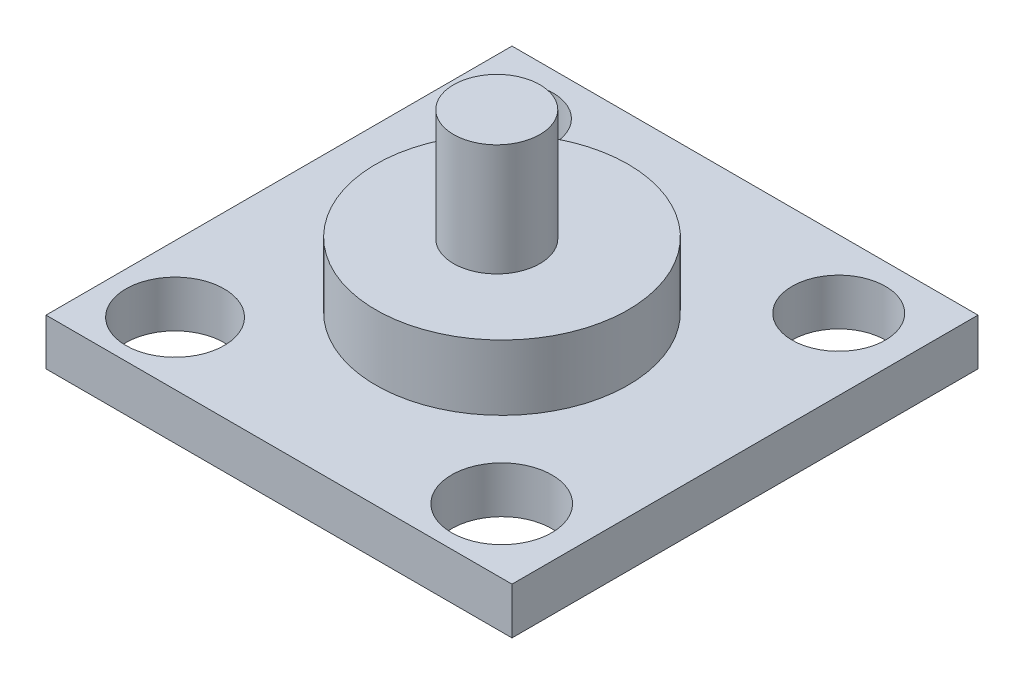
ISO-10303-21;
HEADER;
FILE_DESCRIPTION(('STEP AP214'),'2;1');
FILE_NAME('part.step','',(''),(''),'','','');
FILE_SCHEMA(('AUTOMOTIVE_DESIGN { 1 0 10303 214 1 1 1 1 }'));
ENDSEC;
DATA;
#1=APPLICATION_CONTEXT('core data for automotive mechanical design processes');
#2=APPLICATION_PROTOCOL_DEFINITION('international standard','automotive_design',2000,#1);
#3=PRODUCT_CONTEXT('',#1,'mechanical');
#4=PRODUCT('Part','Part','',(#3));
#5=PRODUCT_RELATED_PRODUCT_CATEGORY('part','',(#4));
#6=PRODUCT_DEFINITION_FORMATION('','',#4);
#7=PRODUCT_DEFINITION_CONTEXT('part definition',#1,'design');
#8=PRODUCT_DEFINITION('design','',#6,#7);
#9=PRODUCT_DEFINITION_SHAPE('','',#8);
#10=(LENGTH_UNIT() NAMED_UNIT(*) SI_UNIT(.MILLI.,.METRE.));
#11=(NAMED_UNIT(*) PLANE_ANGLE_UNIT() SI_UNIT($,.RADIAN.));
#12=(NAMED_UNIT(*) SI_UNIT($,.STERADIAN.) SOLID_ANGLE_UNIT());
#13=UNCERTAINTY_MEASURE_WITH_UNIT(LENGTH_MEASURE(1.E-05),#10,'distance_accuracy_value','');
#14=(GEOMETRIC_REPRESENTATION_CONTEXT(3) GLOBAL_UNCERTAINTY_ASSIGNED_CONTEXT((#13)) GLOBAL_UNIT_ASSIGNED_CONTEXT((#10,
#11,#12)) REPRESENTATION_CONTEXT('',''));
#15=CARTESIAN_POINT('',(0.,0.,0.));
#16=DIRECTION('',(0.,0.,1.));
#17=DIRECTION('',(1.,0.,0.));
#18=AXIS2_PLACEMENT_3D('',#15,#16,#17);
#19=CARTESIAN_POINT('',(67.7047001566798,1.27,0.));
#20=DIRECTION('',(1.,0.,0.));
#21=DIRECTION('',(0.,0.,-1.));
#22=AXIS2_PLACEMENT_3D('',#19,#20,#21);
#23=PLANE('',#22);
#24=DIRECTION('',(0.,0.,1.));
#25=VECTOR('',#24,1.);
#26=CARTESIAN_POINT('',(67.7047001566798,0.,0.));
#27=LINE('',#26,#25);
#28=CARTESIAN_POINT('',(67.7047001566798,0.,-15.0304434347829));
#29=VERTEX_POINT('',#28);
#30=CARTESIAN_POINT('',(67.7047001566798,0.,-2.33044343478292));
#31=VERTEX_POINT('',#30);
#32=EDGE_CURVE('E108',#29,#31,#27,.T.);
#33=ORIENTED_EDGE('',*,*,#32,.F.);
#34=DIRECTION('',(0.,-1.,0.));
#35=VECTOR('',#34,1.);
#36=CARTESIAN_POINT('',(67.7047001566798,1.27,-15.0304434347829));
#37=LINE('',#36,#35);
#38=CARTESIAN_POINT('',(67.7047001566798,1.27,-15.0304434347829));
#39=VERTEX_POINT('',#38);
#40=EDGE_CURVE('E49',#39,#29,#37,.T.);
#41=ORIENTED_EDGE('',*,*,#40,.F.);
#42=DIRECTION('',(0.,0.,1.));
#43=VECTOR('',#42,1.);
#44=CARTESIAN_POINT('',(67.7047001566798,1.27,0.));
#45=LINE('',#44,#43);
#46=CARTESIAN_POINT('',(67.7047001566798,1.27,-2.33044343478292));
#47=VERTEX_POINT('',#46);
#48=EDGE_CURVE('E101',#39,#47,#45,.T.);
#49=ORIENTED_EDGE('',*,*,#48,.T.);
#50=DIRECTION('',(0.,-1.,0.));
#51=VECTOR('',#50,1.);
#52=CARTESIAN_POINT('',(67.7047001566798,1.27,-2.33044343478292));
#53=LINE('',#52,#51);
#54=EDGE_CURVE('E80',#47,#31,#53,.T.);
#55=ORIENTED_EDGE('',*,*,#54,.T.);
#56=EDGE_LOOP('',(#33,#41,#49,#55));
#57=FACE_BOUND('',#56,.T.);
#58=ADVANCED_FACE('F41',(#57),#23,.T.);
#59=CARTESIAN_POINT('',(0.,1.27,-15.0304434347829));
#60=DIRECTION('',(0.,0.,-1.));
#61=DIRECTION('',(-1.,0.,0.));
#62=AXIS2_PLACEMENT_3D('',#59,#60,#61);
#63=PLANE('',#62);
#64=DIRECTION('',(1.,0.,0.));
#65=VECTOR('',#64,1.);
#66=CARTESIAN_POINT('',(0.,0.,-15.0304434347829));
#67=LINE('',#66,#65);
#68=CARTESIAN_POINT('',(55.0047001566799,0.,-15.0304434347829));
#69=VERTEX_POINT('',#68);
#70=EDGE_CURVE('E94',#69,#29,#67,.T.);
#71=ORIENTED_EDGE('',*,*,#70,.F.);
#72=DIRECTION('',(0.,-1.,0.));
#73=VECTOR('',#72,1.);
#74=CARTESIAN_POINT('',(55.0047001566799,1.27,-15.0304434347829));
#75=LINE('',#74,#73);
#76=CARTESIAN_POINT('',(55.0047001566799,1.27,-15.0304434347829));
#77=VERTEX_POINT('',#76);
#78=EDGE_CURVE('E88',#77,#69,#75,.T.);
#79=ORIENTED_EDGE('',*,*,#78,.F.);
#80=DIRECTION('',(1.,0.,0.));
#81=VECTOR('',#80,1.);
#82=CARTESIAN_POINT('',(0.,1.27,-15.0304434347829));
#83=LINE('',#82,#81);
#84=EDGE_CURVE('E92',#77,#39,#83,.T.);
#85=ORIENTED_EDGE('',*,*,#84,.T.);
#86=ORIENTED_EDGE('',*,*,#40,.T.);
#87=EDGE_LOOP('',(#71,#79,#85,#86));
#88=FACE_BOUND('',#87,.T.);
#89=ADVANCED_FACE('F90',(#88),#63,.T.);
#90=CARTESIAN_POINT('',(55.0047001566798,1.27,0.));
#91=DIRECTION('',(1.,0.,0.));
#92=DIRECTION('',(0.,0.,-1.));
#93=AXIS2_PLACEMENT_3D('',#90,#91,#92);
#94=PLANE('',#93);
#95=DIRECTION('',(0.,0.,1.));
#96=VECTOR('',#95,1.);
#97=CARTESIAN_POINT('',(55.0047001566798,0.,0.));
#98=LINE('',#97,#96);
#99=CARTESIAN_POINT('',(55.0047001566798,0.,-2.33044343478292));
#100=VERTEX_POINT('',#99);
#101=EDGE_CURVE('E73',#69,#100,#98,.T.);
#102=ORIENTED_EDGE('',*,*,#101,.T.);
#103=DIRECTION('',(0.,-1.,0.));
#104=VECTOR('',#103,1.);
#105=CARTESIAN_POINT('',(55.0047001566798,1.27,-2.33044343478292));
#106=LINE('',#105,#104);
#107=CARTESIAN_POINT('',(55.0047001566798,1.27,-2.33044343478292));
#108=VERTEX_POINT('',#107);
#109=EDGE_CURVE('E95',#108,#100,#106,.T.);
#110=ORIENTED_EDGE('',*,*,#109,.F.);
#111=DIRECTION('',(0.,0.,1.));
#112=VECTOR('',#111,1.);
#113=CARTESIAN_POINT('',(55.0047001566798,1.27,0.));
#114=LINE('',#113,#112);
#115=EDGE_CURVE('E97',#77,#108,#114,.T.);
#116=ORIENTED_EDGE('',*,*,#115,.F.);
#117=ORIENTED_EDGE('',*,*,#78,.T.);
#118=EDGE_LOOP('',(#102,#110,#116,#117));
#119=FACE_BOUND('',#118,.T.);
#120=ADVANCED_FACE('F98',(#119),#94,.F.);
#121=CARTESIAN_POINT('',(0.,1.27,-2.33044343478292));
#122=DIRECTION('',(0.,0.,-1.));
#123=DIRECTION('',(-1.,0.,0.));
#124=AXIS2_PLACEMENT_3D('',#121,#122,#123);
#125=PLANE('',#124);
#126=DIRECTION('',(1.,0.,0.));
#127=VECTOR('',#126,1.);
#128=CARTESIAN_POINT('',(0.,0.,-2.33044343478292));
#129=LINE('',#128,#127);
#130=EDGE_CURVE('E103',#100,#31,#129,.T.);
#131=ORIENTED_EDGE('',*,*,#130,.T.);
#132=ORIENTED_EDGE('',*,*,#54,.F.);
#133=DIRECTION('',(1.,0.,0.));
#134=VECTOR('',#133,1.);
#135=CARTESIAN_POINT('',(0.,1.27,-2.33044343478292));
#136=LINE('',#135,#134);
#137=EDGE_CURVE('E57',#108,#47,#136,.T.);
#138=ORIENTED_EDGE('',*,*,#137,.F.);
#139=ORIENTED_EDGE('',*,*,#109,.T.);
#140=EDGE_LOOP('',(#131,#132,#138,#139));
#141=FACE_BOUND('',#140,.T.);
#142=ADVANCED_FACE('F120',(#141),#125,.F.);
#143=CARTESIAN_POINT('',(0.,1.27,0.));
#144=DIRECTION('',(0.,1.,0.));
#145=DIRECTION('',(0.,0.,1.));
#146=AXIS2_PLACEMENT_3D('',#143,#144,#145);
#147=PLANE('',#146);
#148=CARTESIAN_POINT('',(61.1539853791689,1.27,-8.60832124117808));
#149=DIRECTION('',(0.,1.,0.));
#150=DIRECTION('',(0.,0.,1.));
#151=AXIS2_PLACEMENT_3D('',#148,#149,#150);
#152=CIRCLE('',#151,3.43807672808481);
#153=CARTESIAN_POINT('',(61.1539853791689,1.27,-12.0463979692629));
#154=VERTEX_POINT('',#153);
#155=EDGE_CURVE('E259',#154,#154,#152,.T.);
#156=ORIENTED_EDGE('',*,*,#155,.F.);
#157=EDGE_LOOP('',(#156));
#158=FACE_BOUND('',#157,.T.);
#159=CARTESIAN_POINT('',(56.812601391577,1.27,-4.03970862787468));
#160=DIRECTION('',(0.,1.,0.));
#161=DIRECTION('',(0.,0.,1.));
#162=AXIS2_PLACEMENT_3D('',#159,#160,#161);
#163=CIRCLE('',#162,1.33890735497977);
#164=CARTESIAN_POINT('',(56.812601391577,1.27,-2.70080127289491));
#165=VERTEX_POINT('',#164);
#166=EDGE_CURVE('E281',#165,#165,#163,.T.);
#167=ORIENTED_EDGE('',*,*,#166,.F.);
#168=EDGE_LOOP('',(#167));
#169=FACE_BOUND('',#168,.T.);
#170=CARTESIAN_POINT('',(65.6678895108768,1.27,-4.08681122425393));
#171=DIRECTION('',(0.,1.,0.));
#172=DIRECTION('',(0.,0.,1.));
#173=AXIS2_PLACEMENT_3D('',#170,#171,#172);
#174=CIRCLE('',#173,1.36597529499837);
#175=CARTESIAN_POINT('',(65.6678895108768,1.27,-2.72083592925556));
#176=VERTEX_POINT('',#175);
#177=EDGE_CURVE('E275',#176,#176,#174,.T.);
#178=ORIENTED_EDGE('',*,*,#177,.F.);
#179=EDGE_LOOP('',(#178));
#180=FACE_BOUND('',#179,.T.);
#181=CARTESIAN_POINT('',(65.7620947036353,1.27,-13.17761232545));
#182=DIRECTION('',(0.,1.,0.));
#183=DIRECTION('',(0.,0.,1.));
#184=AXIS2_PLACEMENT_3D('',#181,#182,#183);
#185=CIRCLE('',#184,1.27177010223988);
#186=CARTESIAN_POINT('',(65.7620947036353,1.27,-11.9058422232102));
#187=VERTEX_POINT('',#186);
#188=EDGE_CURVE('E268',#187,#187,#185,.T.);
#189=ORIENTED_EDGE('',*,*,#188,.F.);
#190=EDGE_LOOP('',(#189));
#191=FACE_BOUND('',#190,.T.);
#192=CARTESIAN_POINT('',(56.6712936024392,1.27,-13.2718175182085));
#193=DIRECTION('',(0.,1.,0.));
#194=DIRECTION('',(0.,0.,1.));
#195=AXIS2_PLACEMENT_3D('',#192,#193,#194);
#196=CIRCLE('',#195,1.21100399715519);
#197=CARTESIAN_POINT('',(56.6712936024392,1.27,-12.0608135210534));
#198=VERTEX_POINT('',#197);
#199=EDGE_CURVE('E271',#198,#198,#196,.T.);
#200=ORIENTED_EDGE('',*,*,#199,.F.);
#201=EDGE_LOOP('',(#200));
#202=FACE_BOUND('',#201,.T.);
#203=ORIENTED_EDGE('',*,*,#48,.F.);
#204=ORIENTED_EDGE('',*,*,#84,.F.);
#205=ORIENTED_EDGE('',*,*,#115,.T.);
#206=ORIENTED_EDGE('',*,*,#137,.T.);
#207=EDGE_LOOP('',(#203,#204,#205,#206));
#208=FACE_BOUND('',#207,.T.);
#209=ADVANCED_FACE('F100',(#158,#169,#180,#191,#202,#208),#147,.T.);
#210=CARTESIAN_POINT('',(0.,0.,0.));
#211=DIRECTION('',(0.,1.,0.));
#212=DIRECTION('',(0.,0.,1.));
#213=AXIS2_PLACEMENT_3D('',#210,#211,#212);
#214=PLANE('',#213);
#215=CARTESIAN_POINT('',(56.812601391577,0.,-4.03970862787468));
#216=DIRECTION('',(0.,1.,0.));
#217=DIRECTION('',(0.,0.,1.));
#218=AXIS2_PLACEMENT_3D('',#215,#216,#217);
#219=CIRCLE('',#218,1.33890735497977);
#220=CARTESIAN_POINT('',(56.812601391577,0.,-2.70080127289491));
#221=VERTEX_POINT('',#220);
#222=EDGE_CURVE('E266',#221,#221,#219,.T.);
#223=ORIENTED_EDGE('',*,*,#222,.T.);
#224=EDGE_LOOP('',(#223));
#225=FACE_BOUND('',#224,.T.);
#226=CARTESIAN_POINT('',(65.6678895108768,0.,-4.08681122425393));
#227=DIRECTION('',(0.,1.,0.));
#228=DIRECTION('',(0.,0.,1.));
#229=AXIS2_PLACEMENT_3D('',#226,#227,#228);
#230=CIRCLE('',#229,1.36597529499837);
#231=CARTESIAN_POINT('',(65.6678895108768,0.,-2.72083592925556));
#232=VERTEX_POINT('',#231);
#233=EDGE_CURVE('E278',#232,#232,#230,.T.);
#234=ORIENTED_EDGE('',*,*,#233,.T.);
#235=EDGE_LOOP('',(#234));
#236=FACE_BOUND('',#235,.T.);
#237=CARTESIAN_POINT('',(65.7620947036353,0.,-13.17761232545));
#238=DIRECTION('',(0.,1.,0.));
#239=DIRECTION('',(0.,0.,1.));
#240=AXIS2_PLACEMENT_3D('',#237,#238,#239);
#241=CIRCLE('',#240,1.27177010223988);
#242=CARTESIAN_POINT('',(65.7620947036353,0.,-11.9058422232102));
#243=VERTEX_POINT('',#242);
#244=EDGE_CURVE('E272',#243,#243,#241,.T.);
#245=ORIENTED_EDGE('',*,*,#244,.T.);
#246=EDGE_LOOP('',(#245));
#247=FACE_BOUND('',#246,.T.);
#248=CARTESIAN_POINT('',(56.6712936024392,0.,-13.2718175182085));
#249=DIRECTION('',(0.,1.,0.));
#250=DIRECTION('',(0.,0.,1.));
#251=AXIS2_PLACEMENT_3D('',#248,#249,#250);
#252=CIRCLE('',#251,1.21100399715519);
#253=CARTESIAN_POINT('',(56.6712936024392,0.,-12.0608135210534));
#254=VERTEX_POINT('',#253);
#255=EDGE_CURVE('E111',#254,#254,#252,.T.);
#256=ORIENTED_EDGE('',*,*,#255,.T.);
#257=EDGE_LOOP('',(#256));
#258=FACE_BOUND('',#257,.T.);
#259=ORIENTED_EDGE('',*,*,#32,.T.);
#260=ORIENTED_EDGE('',*,*,#130,.F.);
#261=ORIENTED_EDGE('',*,*,#101,.F.);
#262=ORIENTED_EDGE('',*,*,#70,.T.);
#263=EDGE_LOOP('',(#259,#260,#261,#262));
#264=FACE_BOUND('',#263,.T.);
#265=ADVANCED_FACE('F118',(#225,#236,#247,#258,#264),#214,.F.);
#266=CARTESIAN_POINT('',(56.6712936024392,0.,-13.2718175182085));
#267=DIRECTION('',(0.,1.,0.));
#268=DIRECTION('',(0.,0.,1.));
#269=AXIS2_PLACEMENT_3D('',#266,#267,#268);
#270=CYLINDRICAL_SURFACE('',#269,1.21100399715519);
#271=ORIENTED_EDGE('',*,*,#255,.F.);
#272=EDGE_LOOP('',(#271));
#273=FACE_BOUND('',#272,.T.);
#274=ORIENTED_EDGE('',*,*,#199,.T.);
#275=EDGE_LOOP('',(#274));
#276=FACE_BOUND('',#275,.T.);
#277=ADVANCED_FACE('F156',(#273,#276),#270,.F.);
#278=CARTESIAN_POINT('',(65.7620947036353,0.,-13.17761232545));
#279=DIRECTION('',(0.,1.,0.));
#280=DIRECTION('',(0.,0.,1.));
#281=AXIS2_PLACEMENT_3D('',#278,#279,#280);
#282=CYLINDRICAL_SURFACE('',#281,1.27177010223988);
#283=ORIENTED_EDGE('',*,*,#244,.F.);
#284=EDGE_LOOP('',(#283));
#285=FACE_BOUND('',#284,.T.);
#286=ORIENTED_EDGE('',*,*,#188,.T.);
#287=EDGE_LOOP('',(#286));
#288=FACE_BOUND('',#287,.T.);
#289=ADVANCED_FACE('F165',(#285,#288),#282,.F.);
#290=CARTESIAN_POINT('',(65.6678895108768,0.,-4.08681122425393));
#291=DIRECTION('',(0.,1.,0.));
#292=DIRECTION('',(0.,0.,1.));
#293=AXIS2_PLACEMENT_3D('',#290,#291,#292);
#294=CYLINDRICAL_SURFACE('',#293,1.36597529499837);
#295=ORIENTED_EDGE('',*,*,#233,.F.);
#296=EDGE_LOOP('',(#295));
#297=FACE_BOUND('',#296,.T.);
#298=ORIENTED_EDGE('',*,*,#177,.T.);
#299=EDGE_LOOP('',(#298));
#300=FACE_BOUND('',#299,.T.);
#301=ADVANCED_FACE('F173',(#297,#300),#294,.F.);
#302=CARTESIAN_POINT('',(56.812601391577,0.,-4.03970862787468));
#303=DIRECTION('',(0.,1.,0.));
#304=DIRECTION('',(0.,0.,1.));
#305=AXIS2_PLACEMENT_3D('',#302,#303,#304);
#306=CYLINDRICAL_SURFACE('',#305,1.33890735497977);
#307=ORIENTED_EDGE('',*,*,#222,.F.);
#308=EDGE_LOOP('',(#307));
#309=FACE_BOUND('',#308,.T.);
#310=ORIENTED_EDGE('',*,*,#166,.T.);
#311=EDGE_LOOP('',(#310));
#312=FACE_BOUND('',#311,.T.);
#313=ADVANCED_FACE('F181',(#309,#312),#306,.F.);
#314=CARTESIAN_POINT('',(61.1539853791689,3.048,-8.60832124117808));
#315=DIRECTION('',(0.,-1.,0.));
#316=DIRECTION('',(0.,0.,-1.));
#317=AXIS2_PLACEMENT_3D('',#314,#315,#316);
#318=CYLINDRICAL_SURFACE('',#317,3.43807672808481);
#319=CARTESIAN_POINT('',(61.1539853791689,3.048,-8.60832124117808));
#320=DIRECTION('',(0.,1.,0.));
#321=DIRECTION('',(0.,0.,1.));
#322=AXIS2_PLACEMENT_3D('',#319,#320,#321);
#323=CIRCLE('',#322,3.43807672808481);
#324=CARTESIAN_POINT('',(61.1539853791689,3.048,-12.0463979692629));
#325=VERTEX_POINT('',#324);
#326=EDGE_CURVE('E262',#325,#325,#323,.T.);
#327=CARTESIAN_POINT('',(61.1539853791689,3.048,-12.0463979692629));
#328=CARTESIAN_POINT('',(61.1539853791689,3.02947916666667,-12.0463979692629));
#329=CARTESIAN_POINT('',(61.1539853791689,3.01095833333334,-12.0463979692629));
#330=CARTESIAN_POINT('',(61.1539853791689,2.97391666666667,-12.0463979692629));
#331=CARTESIAN_POINT('',(61.1539853791689,2.95539583333334,-12.0463979692629));
#332=CARTESIAN_POINT('',(61.1539853791689,2.91835416666667,-12.0463979692629));
#333=CARTESIAN_POINT('',(61.1539853791689,2.89983333333334,-12.0463979692629));
#334=CARTESIAN_POINT('',(61.1539853791689,2.86279166666667,-12.0463979692629));
#335=CARTESIAN_POINT('',(61.1539853791689,2.84427083333334,-12.0463979692629));
#336=CARTESIAN_POINT('',(61.1539853791689,2.80722916666667,-12.0463979692629));
#337=CARTESIAN_POINT('',(61.1539853791689,2.78870833333334,-12.0463979692629));
#338=CARTESIAN_POINT('',(61.1539853791689,2.75166666666667,-12.0463979692629));
#339=CARTESIAN_POINT('',(61.1539853791689,2.73314583333334,-12.0463979692629));
#340=CARTESIAN_POINT('',(61.1539853791689,2.69610416666667,-12.0463979692629));
#341=CARTESIAN_POINT('',(61.1539853791689,2.67758333333333,-12.0463979692629));
#342=CARTESIAN_POINT('',(61.1539853791689,2.64054166666667,-12.0463979692629));
#343=CARTESIAN_POINT('',(61.1539853791689,2.62202083333334,-12.0463979692629));
#344=CARTESIAN_POINT('',(61.1539853791689,2.58497916666667,-12.0463979692629));
#345=CARTESIAN_POINT('',(61.1539853791689,2.56645833333334,-12.0463979692629));
#346=CARTESIAN_POINT('',(61.1539853791689,2.52941666666667,-12.0463979692629));
#347=CARTESIAN_POINT('',(61.1539853791689,2.51089583333333,-12.0463979692629));
#348=CARTESIAN_POINT('',(61.1539853791689,2.47385416666667,-12.0463979692629));
#349=CARTESIAN_POINT('',(61.1539853791689,2.45533333333334,-12.0463979692629));
#350=CARTESIAN_POINT('',(61.1539853791689,2.41829166666667,-12.0463979692629));
#351=CARTESIAN_POINT('',(61.1539853791689,2.39977083333333,-12.0463979692629));
#352=CARTESIAN_POINT('',(61.1539853791689,2.36272916666667,-12.0463979692629));
#353=CARTESIAN_POINT('',(61.1539853791689,2.34420833333333,-12.0463979692629));
#354=CARTESIAN_POINT('',(61.1539853791689,2.30716666666667,-12.0463979692629));
#355=CARTESIAN_POINT('',(61.1539853791689,2.28864583333333,-12.0463979692629));
#356=CARTESIAN_POINT('',(61.1539853791689,2.25160416666667,-12.0463979692629));
#357=CARTESIAN_POINT('',(61.1539853791689,2.23308333333333,-12.0463979692629));
#358=CARTESIAN_POINT('',(61.1539853791689,2.19604166666667,-12.0463979692629));
#359=CARTESIAN_POINT('',(61.1539853791689,2.17752083333333,-12.0463979692629));
#360=CARTESIAN_POINT('',(61.1539853791689,2.14047916666667,-12.0463979692629));
#361=CARTESIAN_POINT('',(61.1539853791689,2.12195833333333,-12.0463979692629));
#362=CARTESIAN_POINT('',(61.1539853791689,2.08491666666667,-12.0463979692629));
#363=CARTESIAN_POINT('',(61.1539853791689,2.06639583333333,-12.0463979692629));
#364=CARTESIAN_POINT('',(61.1539853791689,2.02935416666667,-12.0463979692629));
#365=CARTESIAN_POINT('',(61.1539853791689,2.01083333333333,-12.0463979692629));
#366=CARTESIAN_POINT('',(61.1539853791689,1.97379166666667,-12.0463979692629));
#367=CARTESIAN_POINT('',(61.1539853791689,1.95527083333333,-12.0463979692629));
#368=CARTESIAN_POINT('',(61.1539853791689,1.91822916666667,-12.0463979692629));
#369=CARTESIAN_POINT('',(61.1539853791689,1.89970833333333,-12.0463979692629));
#370=CARTESIAN_POINT('',(61.1539853791689,1.86266666666667,-12.0463979692629));
#371=CARTESIAN_POINT('',(61.1539853791689,1.84414583333333,-12.0463979692629));
#372=CARTESIAN_POINT('',(61.1539853791689,1.80710416666667,-12.0463979692629));
#373=CARTESIAN_POINT('',(61.1539853791689,1.78858333333333,-12.0463979692629));
#374=CARTESIAN_POINT('',(61.1539853791689,1.75154166666667,-12.0463979692629));
#375=CARTESIAN_POINT('',(61.1539853791689,1.73302083333333,-12.0463979692629));
#376=CARTESIAN_POINT('',(61.1539853791689,1.69597916666667,-12.0463979692629));
#377=CARTESIAN_POINT('',(61.1539853791689,1.67745833333333,-12.0463979692629));
#378=CARTESIAN_POINT('',(61.1539853791689,1.64041666666667,-12.0463979692629));
#379=CARTESIAN_POINT('',(61.1539853791689,1.62189583333333,-12.0463979692629));
#380=CARTESIAN_POINT('',(61.1539853791689,1.58485416666667,-12.0463979692629));
#381=CARTESIAN_POINT('',(61.1539853791689,1.56633333333333,-12.0463979692629));
#382=CARTESIAN_POINT('',(61.1539853791689,1.52929166666667,-12.0463979692629));
#383=CARTESIAN_POINT('',(61.1539853791689,1.51077083333333,-12.0463979692629));
#384=CARTESIAN_POINT('',(61.1539853791689,1.47372916666667,-12.0463979692629));
#385=CARTESIAN_POINT('',(61.1539853791689,1.45520833333333,-12.0463979692629));
#386=CARTESIAN_POINT('',(61.1539853791689,1.41816666666667,-12.0463979692629));
#387=CARTESIAN_POINT('',(61.1539853791689,1.39964583333333,-12.0463979692629));
#388=CARTESIAN_POINT('',(61.1539853791689,1.36260416666667,-12.0463979692629));
#389=CARTESIAN_POINT('',(61.1539853791689,1.34408333333333,-12.0463979692629));
#390=CARTESIAN_POINT('',(61.1539853791689,1.30704166666667,-12.0463979692629));
#391=CARTESIAN_POINT('',(61.1539853791689,1.28852083333333,-12.0463979692629));
#392=CARTESIAN_POINT('',(61.1539853791689,1.27,-12.0463979692629));
#393=B_SPLINE_CURVE_WITH_KNOTS('',3,(#327,#328,#329,#330,#331,#332,#333,#334,#335,#336,#337,
#338,#339,#340,#341,#342,#343,#344,#345,#346,#347,#348,#349,#350,#351,#352,#353,#354,#355,#356,
#357,#358,#359,#360,#361,#362,#363,#364,#365,#366,#367,#368,#369,#370,#371,#372,#373,#374,#375,
#376,#377,#378,#379,#380,#381,#382,#383,#384,#385,#386,#387,#388,#389,#390,#391,#392),
.UNSPECIFIED.,.F.,.F.,(4,2,2,2,2,2,2,2,2,2,2,2,2,2,2,2,2,2,2,2,2,2,2,2,2,2,2,2,2,2,2,2,4),(0.,
0.0555624999999996,0.111125,0.1666875,0.22225,0.2778125,0.333375,0.3889375,0.4445,0.5000625,
0.555625,0.6111875,0.66675,0.7223125,0.777875,0.8334375,0.889,0.944562500000001,1.000125,
1.0556875,1.11125,1.1668125,1.222375,1.2779375,1.3335,1.3890625,1.444625,1.5001875,1.55575,
1.6113125,1.666875,1.7224375,1.778),.UNSPECIFIED.);
#394=EDGE_CURVE('BSEAM188',#325,#154,#393,.T.);
#395=ORIENTED_EDGE('',*,*,#326,.F.);
#396=ORIENTED_EDGE('',*,*,#155,.T.);
#397=ORIENTED_EDGE('',*,*,#394,.T.);
#398=ORIENTED_EDGE('',*,*,#394,.F.);
#399=EDGE_LOOP('',(#395,#397,#396,#398));
#400=FACE_BOUND('',#399,.T.);
#401=ADVANCED_FACE('F188',(#400),#318,.T.);
#402=CARTESIAN_POINT('',(61.1539853791689,3.048,-8.60832124117808));
#403=DIRECTION('',(0.,1.,0.));
#404=DIRECTION('',(0.,0.,1.));
#405=AXIS2_PLACEMENT_3D('',#402,#403,#404);
#406=PLANE('',#405);
#407=CARTESIAN_POINT('',(61.122804521128,3.048,-8.49685938997107));
#408=DIRECTION('',(0.,1.,0.));
#409=DIRECTION('',(0.,0.,1.));
#410=AXIS2_PLACEMENT_3D('',#407,#408,#409);
#411=CIRCLE('',#410,1.17642443484677);
#412=CARTESIAN_POINT('',(61.122804521128,3.048,-7.3204349551243));
#413=VERTEX_POINT('',#412);
#414=EDGE_CURVE('E11',#413,#413,#411,.T.);
#415=ORIENTED_EDGE('',*,*,#414,.F.);
#416=EDGE_LOOP('',(#415));
#417=FACE_BOUND('',#416,.T.);
#418=ORIENTED_EDGE('',*,*,#326,.T.);
#419=EDGE_LOOP('',(#418));
#420=FACE_BOUND('',#419,.T.);
#421=ADVANCED_FACE('F195',(#417,#420),#406,.T.);
#422=CARTESIAN_POINT('',(61.122804521128,0.508000000000002,-8.49685938997107));
#423=DIRECTION('',(0.,1.,0.));
#424=DIRECTION('',(0.,0.,1.));
#425=AXIS2_PLACEMENT_3D('',#422,#423,#424);
#426=CYLINDRICAL_SURFACE('',#425,1.17642443484677);
#427=ORIENTED_EDGE('',*,*,#414,.T.);
#428=EDGE_LOOP('',(#427));
#429=FACE_BOUND('',#428,.T.);
#430=CARTESIAN_POINT('',(61.122804521128,6.096,-8.49685938997107));
#431=DIRECTION('',(0.,1.,0.));
#432=DIRECTION('',(0.,0.,1.));
#433=AXIS2_PLACEMENT_3D('',#430,#431,#432);
#434=CIRCLE('',#433,1.17642443484677);
#435=CARTESIAN_POINT('',(61.122804521128,6.096,-7.3204349551243));
#436=VERTEX_POINT('',#435);
#437=EDGE_CURVE('E257',#436,#436,#434,.T.);
#438=ORIENTED_EDGE('',*,*,#437,.F.);
#439=EDGE_LOOP('',(#438));
#440=FACE_BOUND('',#439,.T.);
#441=ADVANCED_FACE('F203',(#429,#440),#426,.T.);
#442=CARTESIAN_POINT('',(61.122804521128,6.096,-8.49685938997107));
#443=DIRECTION('',(0.,1.,0.));
#444=DIRECTION('',(0.,0.,1.));
#445=AXIS2_PLACEMENT_3D('',#442,#443,#444);
#446=PLANE('',#445);
#447=ORIENTED_EDGE('',*,*,#437,.T.);
#448=EDGE_LOOP('',(#447));
#449=FACE_BOUND('',#448,.T.);
#450=ADVANCED_FACE('F211',(#449),#446,.T.);
#451=CLOSED_SHELL('',(#58,#89,#120,#142,#209,#265,#277,#289,#301,#313,#401,#421,#441,#450));
#452=MANIFOLD_SOLID_BREP('B2',#451);
#453=ADVANCED_BREP_SHAPE_REPRESENTATION('',(#18,#452),#14);
#454=SHAPE_DEFINITION_REPRESENTATION(#9,#453);
ENDSEC;
END-ISO-10303-21;
